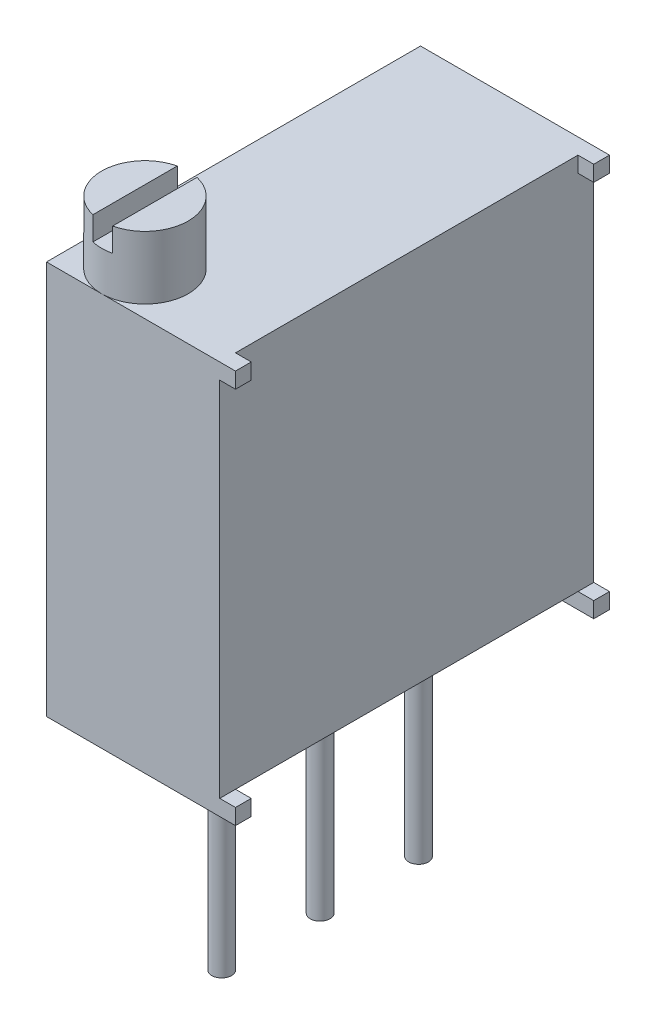
ISO-10303-21;
HEADER;
FILE_DESCRIPTION(('STEP AP214'),'2;1');
FILE_NAME('part.step','',(''),(''),'','','');
FILE_SCHEMA(('AUTOMOTIVE_DESIGN { 1 0 10303 214 1 1 1 1 }'));
ENDSEC;
DATA;
#1=APPLICATION_CONTEXT('core data for automotive mechanical design processes');
#2=APPLICATION_PROTOCOL_DEFINITION('international standard','automotive_design',2000,#1);
#3=PRODUCT_CONTEXT('',#1,'mechanical');
#4=PRODUCT('Part','Part','',(#3));
#5=PRODUCT_RELATED_PRODUCT_CATEGORY('part','',(#4));
#6=PRODUCT_DEFINITION_FORMATION('','',#4);
#7=PRODUCT_DEFINITION_CONTEXT('part definition',#1,'design');
#8=PRODUCT_DEFINITION('design','',#6,#7);
#9=PRODUCT_DEFINITION_SHAPE('','',#8);
#10=(LENGTH_UNIT() NAMED_UNIT(*) SI_UNIT(.MILLI.,.METRE.));
#11=(NAMED_UNIT(*) PLANE_ANGLE_UNIT() SI_UNIT($,.RADIAN.));
#12=(NAMED_UNIT(*) SI_UNIT($,.STERADIAN.) SOLID_ANGLE_UNIT());
#13=UNCERTAINTY_MEASURE_WITH_UNIT(LENGTH_MEASURE(1.E-05),#10,'distance_accuracy_value','');
#14=(GEOMETRIC_REPRESENTATION_CONTEXT(3) GLOBAL_UNCERTAINTY_ASSIGNED_CONTEXT((#13)) GLOBAL_UNIT_ASSIGNED_CONTEXT((#10,
#11,#12)) REPRESENTATION_CONTEXT('',''));
#15=CARTESIAN_POINT('',(0.,0.,0.));
#16=DIRECTION('',(0.,0.,1.));
#17=DIRECTION('',(1.,0.,0.));
#18=AXIS2_PLACEMENT_3D('',#15,#16,#17);
#19=CARTESIAN_POINT('',(1.4,6.4,3.65));
#20=DIRECTION('',(0.,-1.,0.));
#21=DIRECTION('',(0.,0.,-1.));
#22=AXIS2_PLACEMENT_3D('',#19,#20,#21);
#23=CYLINDRICAL_SURFACE('',#22,1.1);
#24=CARTESIAN_POINT('',(1.4,4.8,3.65));
#25=DIRECTION('',(0.,1.,0.));
#26=DIRECTION('',(0.,0.,1.));
#27=AXIS2_PLACEMENT_3D('',#24,#25,#26);
#28=CIRCLE('',#27,1.1);
#29=CARTESIAN_POINT('',(1.4,4.8,4.75));
#30=VERTEX_POINT('',#29);
#31=EDGE_CURVE('E203',#30,#30,#28,.T.);
#32=ORIENTED_EDGE('',*,*,#31,.T.);
#33=EDGE_LOOP('',(#32));
#34=FACE_BOUND('',#33,.T.);
#35=DIRECTION('',(0.,-1.,0.));
#36=VECTOR('',#35,1.);
#37=CARTESIAN_POINT('',(1.65,6.4,2.57878573571857));
#38=LINE('',#37,#36);
#39=CARTESIAN_POINT('',(1.65,6.4,2.57878573571857));
#40=VERTEX_POINT('',#39);
#41=CARTESIAN_POINT('',(1.65,5.8,2.57878573571857));
#42=VERTEX_POINT('',#41);
#43=EDGE_CURVE('E208',#40,#42,#38,.T.);
#44=ORIENTED_EDGE('',*,*,#43,.F.);
#45=CARTESIAN_POINT('',(1.4,6.4,3.65));
#46=DIRECTION('',(0.,1.,0.));
#47=DIRECTION('',(0.,0.,1.));
#48=AXIS2_PLACEMENT_3D('',#45,#46,#47);
#49=CIRCLE('',#48,1.1);
#50=CARTESIAN_POINT('',(1.65,6.4,4.72121426428143));
#51=VERTEX_POINT('',#50);
#52=EDGE_CURVE('E202',#51,#40,#49,.T.);
#53=ORIENTED_EDGE('',*,*,#52,.F.);
#54=DIRECTION('',(0.,-1.,0.));
#55=VECTOR('',#54,1.);
#56=CARTESIAN_POINT('',(1.65,6.4,4.72121426428143));
#57=LINE('',#56,#55);
#58=CARTESIAN_POINT('',(1.65,5.8,4.72121426428143));
#59=VERTEX_POINT('',#58);
#60=EDGE_CURVE('E610',#59,#51,#57,.F.);
#61=ORIENTED_EDGE('',*,*,#60,.F.);
#62=CARTESIAN_POINT('',(1.4,5.8,3.65));
#63=DIRECTION('',(0.,1.,0.));
#64=DIRECTION('',(0.,0.,1.));
#65=AXIS2_PLACEMENT_3D('',#62,#63,#64);
#66=CIRCLE('',#65,1.1);
#67=CARTESIAN_POINT('',(1.15,5.8,4.72121426428143));
#68=VERTEX_POINT('',#67);
#69=EDGE_CURVE('E198',#68,#59,#66,.T.);
#70=ORIENTED_EDGE('',*,*,#69,.F.);
#71=DIRECTION('',(0.,-1.,0.));
#72=VECTOR('',#71,1.);
#73=CARTESIAN_POINT('',(1.15,6.4,4.72121426428143));
#74=LINE('',#73,#72);
#75=CARTESIAN_POINT('',(1.15,6.4,4.72121426428143));
#76=VERTEX_POINT('',#75);
#77=EDGE_CURVE('E185',#68,#76,#74,.F.);
#78=ORIENTED_EDGE('',*,*,#77,.T.);
#79=CARTESIAN_POINT('',(1.15,6.4,2.57878573571857));
#80=VERTEX_POINT('',#79);
#81=EDGE_CURVE('E196',#80,#76,#49,.T.);
#82=ORIENTED_EDGE('',*,*,#81,.F.);
#83=DIRECTION('',(0.,-1.,0.));
#84=VECTOR('',#83,1.);
#85=CARTESIAN_POINT('',(1.15,6.4,2.57878573571857));
#86=LINE('',#85,#84);
#87=CARTESIAN_POINT('',(1.15,5.8,2.57878573571857));
#88=VERTEX_POINT('',#87);
#89=EDGE_CURVE('E52',#80,#88,#86,.T.);
#90=ORIENTED_EDGE('',*,*,#89,.T.);
#91=EDGE_CURVE('E347',#42,#88,#66,.T.);
#92=ORIENTED_EDGE('',*,*,#91,.F.);
#93=EDGE_LOOP('',(#44,#53,#61,#70,#78,#82,#90,#92));
#94=FACE_BOUND('',#93,.T.);
#95=ADVANCED_FACE('F37',(#34,#94),#23,.T.);
#96=CARTESIAN_POINT('',(1.4,6.4,3.65));
#97=DIRECTION('',(0.,1.,0.));
#98=DIRECTION('',(0.,0.,1.));
#99=AXIS2_PLACEMENT_3D('',#96,#97,#98);
#100=PLANE('',#99);
#101=ORIENTED_EDGE('',*,*,#52,.T.);
#102=DIRECTION('',(0.,0.,1.));
#103=VECTOR('',#102,1.);
#104=CARTESIAN_POINT('',(1.65,6.4,3.65));
#105=LINE('',#104,#103);
#106=EDGE_CURVE('E190',#40,#51,#105,.T.);
#107=ORIENTED_EDGE('',*,*,#106,.T.);
#108=EDGE_LOOP('',(#101,#107));
#109=FACE_BOUND('',#108,.T.);
#110=ADVANCED_FACE('F358',(#109),#100,.T.);
#111=CARTESIAN_POINT('',(4.4,-4.8,0.));
#112=DIRECTION('',(0.,1.,0.));
#113=DIRECTION('',(0.,0.,1.));
#114=AXIS2_PLACEMENT_3D('',#111,#112,#113);
#115=PLANE('',#114);
#116=CARTESIAN_POINT('',(2.2,-4.8,-2.5));
#117=DIRECTION('',(0.,1.,0.));
#118=DIRECTION('',(0.,0.,1.));
#119=AXIS2_PLACEMENT_3D('',#116,#117,#118);
#120=CIRCLE('',#119,0.25);
#121=CARTESIAN_POINT('',(2.2,-4.8,-2.25));
#122=VERTEX_POINT('',#121);
#123=EDGE_CURVE('E11',#122,#122,#120,.F.);
#124=ORIENTED_EDGE('',*,*,#123,.F.);
#125=EDGE_LOOP('',(#124));
#126=FACE_BOUND('',#125,.T.);
#127=CARTESIAN_POINT('',(2.2,-4.8,2.5));
#128=DIRECTION('',(0.,1.,0.));
#129=DIRECTION('',(0.,0.,1.));
#130=AXIS2_PLACEMENT_3D('',#127,#128,#129);
#131=CIRCLE('',#130,0.25);
#132=CARTESIAN_POINT('',(2.2,-4.8,2.75));
#133=VERTEX_POINT('',#132);
#134=EDGE_CURVE('E45',#133,#133,#131,.F.);
#135=ORIENTED_EDGE('',*,*,#134,.F.);
#136=EDGE_LOOP('',(#135));
#137=FACE_BOUND('',#136,.T.);
#138=CARTESIAN_POINT('',(2.2,-4.8,0.));
#139=DIRECTION('',(0.,1.,0.));
#140=DIRECTION('',(0.,0.,1.));
#141=AXIS2_PLACEMENT_3D('',#138,#139,#140);
#142=CIRCLE('',#141,0.25);
#143=CARTESIAN_POINT('',(2.2,-4.8,0.25));
#144=VERTEX_POINT('',#143);
#145=EDGE_CURVE('E348',#144,#144,#142,.F.);
#146=ORIENTED_EDGE('',*,*,#145,.F.);
#147=EDGE_LOOP('',(#146));
#148=FACE_BOUND('',#147,.T.);
#149=DIRECTION('',(0.,0.,-1.));
#150=VECTOR('',#149,1.);
#151=CARTESIAN_POINT('',(4.4,-4.8,0.));
#152=LINE('',#151,#150);
#153=CARTESIAN_POINT('',(4.4,-4.8,4.35));
#154=VERTEX_POINT('',#153);
#155=CARTESIAN_POINT('',(4.4,-4.8,-4.35));
#156=VERTEX_POINT('',#155);
#157=EDGE_CURVE('E60',#154,#156,#152,.T.);
#158=ORIENTED_EDGE('',*,*,#157,.F.);
#159=DIRECTION('',(-1.,0.,0.));
#160=VECTOR('',#159,1.);
#161=CARTESIAN_POINT('',(4.8,-4.8,4.35));
#162=LINE('',#161,#160);
#163=CARTESIAN_POINT('',(0.,-4.8,4.35));
#164=VERTEX_POINT('',#163);
#165=EDGE_CURVE('E217',#154,#164,#162,.T.);
#166=ORIENTED_EDGE('',*,*,#165,.T.);
#167=DIRECTION('',(0.,0.,-1.));
#168=VECTOR('',#167,1.);
#169=CARTESIAN_POINT('',(0.,-4.8,0.));
#170=LINE('',#169,#168);
#171=CARTESIAN_POINT('',(0.,-4.8,-4.35));
#172=VERTEX_POINT('',#171);
#173=EDGE_CURVE('E340',#164,#172,#170,.T.);
#174=ORIENTED_EDGE('',*,*,#173,.T.);
#175=DIRECTION('',(-1.,0.,0.));
#176=VECTOR('',#175,1.);
#177=CARTESIAN_POINT('',(4.8,-4.8,-4.35));
#178=LINE('',#177,#176);
#179=EDGE_CURVE('E191',#156,#172,#178,.T.);
#180=ORIENTED_EDGE('',*,*,#179,.F.);
#181=EDGE_LOOP('',(#158,#166,#174,#180));
#182=FACE_BOUND('',#181,.T.);
#183=ADVANCED_FACE('F355',(#126,#137,#148,#182),#115,.F.);
#184=CARTESIAN_POINT('',(4.4,4.8,0.));
#185=DIRECTION('',(0.,1.,0.));
#186=DIRECTION('',(0.,0.,1.));
#187=AXIS2_PLACEMENT_3D('',#184,#185,#186);
#188=PLANE('',#187);
#189=DIRECTION('',(-1.,0.,0.));
#190=VECTOR('',#189,1.);
#191=CARTESIAN_POINT('',(4.8,4.8,4.75));
#192=LINE('',#191,#190);
#193=CARTESIAN_POINT('',(0.,4.8,4.75));
#194=VERTEX_POINT('',#193);
#195=EDGE_CURVE('E250',#30,#194,#192,.T.);
#196=ORIENTED_EDGE('',*,*,#195,.F.);
#197=ORIENTED_EDGE('',*,*,#31,.F.);
#198=CARTESIAN_POINT('',(4.8,4.8,4.75));
#199=VERTEX_POINT('',#198);
#200=EDGE_CURVE('E251',#199,#30,#192,.T.);
#201=ORIENTED_EDGE('',*,*,#200,.F.);
#202=DIRECTION('',(0.,0.,-1.));
#203=VECTOR('',#202,1.);
#204=CARTESIAN_POINT('',(4.8,4.8,4.75));
#205=LINE('',#204,#203);
#206=CARTESIAN_POINT('',(4.8,4.8,4.35));
#207=VERTEX_POINT('',#206);
#208=EDGE_CURVE('E253',#199,#207,#205,.T.);
#209=ORIENTED_EDGE('',*,*,#208,.T.);
#210=DIRECTION('',(-1.,0.,0.));
#211=VECTOR('',#210,1.);
#212=CARTESIAN_POINT('',(4.8,4.8,4.35));
#213=LINE('',#212,#211);
#214=CARTESIAN_POINT('',(4.4,4.8,4.35));
#215=VERTEX_POINT('',#214);
#216=EDGE_CURVE('E247',#207,#215,#213,.T.);
#217=ORIENTED_EDGE('',*,*,#216,.T.);
#218=DIRECTION('',(0.,0.,-1.));
#219=VECTOR('',#218,1.);
#220=CARTESIAN_POINT('',(4.4,4.8,0.));
#221=LINE('',#220,#219);
#222=CARTESIAN_POINT('',(4.4,4.8,-4.35));
#223=VERTEX_POINT('',#222);
#224=EDGE_CURVE('E315',#215,#223,#221,.T.);
#225=ORIENTED_EDGE('',*,*,#224,.T.);
#226=DIRECTION('',(-1.,0.,0.));
#227=VECTOR('',#226,1.);
#228=CARTESIAN_POINT('',(4.8,4.8,-4.35));
#229=LINE('',#228,#227);
#230=CARTESIAN_POINT('',(4.8,4.8,-4.35));
#231=VERTEX_POINT('',#230);
#232=EDGE_CURVE('E311',#231,#223,#229,.T.);
#233=ORIENTED_EDGE('',*,*,#232,.F.);
#234=DIRECTION('',(0.,0.,-1.));
#235=VECTOR('',#234,1.);
#236=CARTESIAN_POINT('',(4.8,4.8,0.));
#237=LINE('',#236,#235);
#238=CARTESIAN_POINT('',(4.8,4.8,-4.75));
#239=VERTEX_POINT('',#238);
#240=EDGE_CURVE('E283',#231,#239,#237,.T.);
#241=ORIENTED_EDGE('',*,*,#240,.T.);
#242=DIRECTION('',(-1.,0.,0.));
#243=VECTOR('',#242,1.);
#244=CARTESIAN_POINT('',(4.8,4.8,-4.75));
#245=LINE('',#244,#243);
#246=CARTESIAN_POINT('',(0.,4.8,-4.75));
#247=VERTEX_POINT('',#246);
#248=EDGE_CURVE('E302',#239,#247,#245,.T.);
#249=ORIENTED_EDGE('',*,*,#248,.T.);
#250=DIRECTION('',(0.,0.,-1.));
#251=VECTOR('',#250,1.);
#252=CARTESIAN_POINT('',(0.,4.8,0.));
#253=LINE('',#252,#251);
#254=EDGE_CURVE('E314',#194,#247,#253,.T.);
#255=ORIENTED_EDGE('',*,*,#254,.F.);
#256=EDGE_LOOP('',(#196,#197,#201,#209,#217,#225,#233,#241,#249,#255));
#257=FACE_BOUND('',#256,.T.);
#258=ADVANCED_FACE('F39',(#257),#188,.T.);
#259=CARTESIAN_POINT('',(4.4,0.,4.75));
#260=DIRECTION('',(0.,0.,1.));
#261=DIRECTION('',(1.,0.,0.));
#262=AXIS2_PLACEMENT_3D('',#259,#260,#261);
#263=PLANE('',#262);
#264=DIRECTION('',(0.,1.,0.));
#265=VECTOR('',#264,1.);
#266=CARTESIAN_POINT('',(0.,0.,4.75));
#267=LINE('',#266,#265);
#268=CARTESIAN_POINT('',(0.,-5.2,4.75));
#269=VERTEX_POINT('',#268);
#270=EDGE_CURVE('E337',#269,#194,#267,.T.);
#271=ORIENTED_EDGE('',*,*,#270,.F.);
#272=DIRECTION('',(-1.,0.,0.));
#273=VECTOR('',#272,1.);
#274=CARTESIAN_POINT('',(4.8,-5.2,4.75));
#275=LINE('',#274,#273);
#276=CARTESIAN_POINT('',(4.8,-5.2,4.75));
#277=VERTEX_POINT('',#276);
#278=EDGE_CURVE('E206',#277,#269,#275,.T.);
#279=ORIENTED_EDGE('',*,*,#278,.F.);
#280=DIRECTION('',(0.,-1.,0.));
#281=VECTOR('',#280,1.);
#282=CARTESIAN_POINT('',(4.8,-4.8,4.75));
#283=LINE('',#282,#281);
#284=CARTESIAN_POINT('',(4.8,-4.8,4.75));
#285=VERTEX_POINT('',#284);
#286=EDGE_CURVE('E229',#285,#277,#283,.T.);
#287=ORIENTED_EDGE('',*,*,#286,.F.);
#288=DIRECTION('',(-1.,0.,0.));
#289=VECTOR('',#288,1.);
#290=CARTESIAN_POINT('',(4.8,-4.8,4.75));
#291=LINE('',#290,#289);
#292=CARTESIAN_POINT('',(4.4,-4.8,4.75));
#293=VERTEX_POINT('',#292);
#294=EDGE_CURVE('E221',#285,#293,#291,.T.);
#295=ORIENTED_EDGE('',*,*,#294,.T.);
#296=DIRECTION('',(0.,1.,0.));
#297=VECTOR('',#296,1.);
#298=CARTESIAN_POINT('',(4.4,0.,4.75));
#299=LINE('',#298,#297);
#300=CARTESIAN_POINT('',(4.4,4.4,4.75));
#301=VERTEX_POINT('',#300);
#302=EDGE_CURVE('E323',#293,#301,#299,.T.);
#303=ORIENTED_EDGE('',*,*,#302,.T.);
#304=DIRECTION('',(-1.,0.,0.));
#305=VECTOR('',#304,1.);
#306=CARTESIAN_POINT('',(4.8,4.4,4.75));
#307=LINE('',#306,#305);
#308=CARTESIAN_POINT('',(4.8,4.4,4.75));
#309=VERTEX_POINT('',#308);
#310=EDGE_CURVE('E232',#309,#301,#307,.T.);
#311=ORIENTED_EDGE('',*,*,#310,.F.);
#312=DIRECTION('',(0.,-1.,0.));
#313=VECTOR('',#312,1.);
#314=CARTESIAN_POINT('',(4.8,4.8,4.75));
#315=LINE('',#314,#313);
#316=EDGE_CURVE('E261',#199,#309,#315,.T.);
#317=ORIENTED_EDGE('',*,*,#316,.F.);
#318=ORIENTED_EDGE('',*,*,#200,.T.);
#319=ORIENTED_EDGE('',*,*,#195,.T.);
#320=EDGE_LOOP('',(#271,#279,#287,#295,#303,#311,#317,#318,#319));
#321=FACE_BOUND('',#320,.T.);
#322=ADVANCED_FACE('F453',(#321),#263,.T.);
#323=CARTESIAN_POINT('',(4.4,0.,-4.75));
#324=DIRECTION('',(0.,0.,1.));
#325=DIRECTION('',(1.,0.,0.));
#326=AXIS2_PLACEMENT_3D('',#323,#324,#325);
#327=PLANE('',#326);
#328=DIRECTION('',(0.,1.,0.));
#329=VECTOR('',#328,1.);
#330=CARTESIAN_POINT('',(0.,0.,-4.75));
#331=LINE('',#330,#329);
#332=CARTESIAN_POINT('',(0.,-5.2,-4.75));
#333=VERTEX_POINT('',#332);
#334=EDGE_CURVE('E318',#333,#247,#331,.T.);
#335=ORIENTED_EDGE('',*,*,#334,.T.);
#336=ORIENTED_EDGE('',*,*,#248,.F.);
#337=DIRECTION('',(0.,1.,0.));
#338=VECTOR('',#337,1.);
#339=CARTESIAN_POINT('',(4.8,0.,-4.75));
#340=LINE('',#339,#338);
#341=CARTESIAN_POINT('',(4.8,4.4,-4.75));
#342=VERTEX_POINT('',#341);
#343=EDGE_CURVE('E300',#342,#239,#340,.T.);
#344=ORIENTED_EDGE('',*,*,#343,.F.);
#345=DIRECTION('',(-1.,0.,0.));
#346=VECTOR('',#345,1.);
#347=CARTESIAN_POINT('',(4.8,4.4,-4.75));
#348=LINE('',#347,#346);
#349=CARTESIAN_POINT('',(4.4,4.4,-4.75));
#350=VERTEX_POINT('',#349);
#351=EDGE_CURVE('E305',#342,#350,#348,.T.);
#352=ORIENTED_EDGE('',*,*,#351,.T.);
#353=DIRECTION('',(0.,1.,0.));
#354=VECTOR('',#353,1.);
#355=CARTESIAN_POINT('',(4.4,0.,-4.75));
#356=LINE('',#355,#354);
#357=CARTESIAN_POINT('',(4.4,-4.8,-4.75));
#358=VERTEX_POINT('',#357);
#359=EDGE_CURVE('E329',#358,#350,#356,.T.);
#360=ORIENTED_EDGE('',*,*,#359,.F.);
#361=DIRECTION('',(-1.,0.,0.));
#362=VECTOR('',#361,1.);
#363=CARTESIAN_POINT('',(4.8,-4.8,-4.75));
#364=LINE('',#363,#362);
#365=CARTESIAN_POINT('',(4.8,-4.8,-4.75));
#366=VERTEX_POINT('',#365);
#367=EDGE_CURVE('E272',#366,#358,#364,.T.);
#368=ORIENTED_EDGE('',*,*,#367,.F.);
#369=DIRECTION('',(0.,-1.,0.));
#370=VECTOR('',#369,1.);
#371=CARTESIAN_POINT('',(4.8,0.,-4.74999999999999));
#372=LINE('',#371,#370);
#373=CARTESIAN_POINT('',(4.8,-5.2,-4.75));
#374=VERTEX_POINT('',#373);
#375=EDGE_CURVE('E275',#366,#374,#372,.T.);
#376=ORIENTED_EDGE('',*,*,#375,.T.);
#377=DIRECTION('',(-1.,0.,0.));
#378=VECTOR('',#377,1.);
#379=CARTESIAN_POINT('',(4.8,-5.2,-4.75));
#380=LINE('',#379,#378);
#381=EDGE_CURVE('E269',#374,#333,#380,.T.);
#382=ORIENTED_EDGE('',*,*,#381,.T.);
#383=EDGE_LOOP('',(#335,#336,#344,#352,#360,#368,#376,#382));
#384=FACE_BOUND('',#383,.T.);
#385=ADVANCED_FACE('F447',(#384),#327,.F.);
#386=CARTESIAN_POINT('',(4.4,0.,0.));
#387=DIRECTION('',(1.,0.,0.));
#388=DIRECTION('',(0.,0.,-1.));
#389=AXIS2_PLACEMENT_3D('',#386,#387,#388);
#390=PLANE('',#389);
#391=ORIENTED_EDGE('',*,*,#224,.F.);
#392=DIRECTION('',(0.,-1.,0.));
#393=VECTOR('',#392,1.);
#394=CARTESIAN_POINT('',(4.4,0.,4.35));
#395=LINE('',#394,#393);
#396=CARTESIAN_POINT('',(4.4,4.4,4.35));
#397=VERTEX_POINT('',#396);
#398=EDGE_CURVE('E317',#215,#397,#395,.T.);
#399=ORIENTED_EDGE('',*,*,#398,.T.);
#400=DIRECTION('',(0.,0.,-1.));
#401=VECTOR('',#400,1.);
#402=CARTESIAN_POINT('',(4.4,4.4,0.));
#403=LINE('',#402,#401);
#404=EDGE_CURVE('E320',#301,#397,#403,.T.);
#405=ORIENTED_EDGE('',*,*,#404,.F.);
#406=ORIENTED_EDGE('',*,*,#302,.F.);
#407=EDGE_CURVE('E327',#293,#154,#152,.T.);
#408=ORIENTED_EDGE('',*,*,#407,.T.);
#409=ORIENTED_EDGE('',*,*,#157,.T.);
#410=EDGE_CURVE('E326',#156,#358,#152,.T.);
#411=ORIENTED_EDGE('',*,*,#410,.T.);
#412=ORIENTED_EDGE('',*,*,#359,.T.);
#413=DIRECTION('',(0.,0.,1.));
#414=VECTOR('',#413,1.);
#415=CARTESIAN_POINT('',(4.4,4.4,0.));
#416=LINE('',#415,#414);
#417=CARTESIAN_POINT('',(4.4,4.4,-4.35));
#418=VERTEX_POINT('',#417);
#419=EDGE_CURVE('E331',#350,#418,#416,.T.);
#420=ORIENTED_EDGE('',*,*,#419,.T.);
#421=DIRECTION('',(0.,-1.,0.));
#422=VECTOR('',#421,1.);
#423=CARTESIAN_POINT('',(4.4,0.,-4.35000000000002));
#424=LINE('',#423,#422);
#425=EDGE_CURVE('E333',#223,#418,#424,.T.);
#426=ORIENTED_EDGE('',*,*,#425,.F.);
#427=EDGE_LOOP('',(#391,#399,#405,#406,#408,#409,#411,#412,#420,#426));
#428=FACE_BOUND('',#427,.T.);
#429=ADVANCED_FACE('F444',(#428),#390,.T.);
#430=CARTESIAN_POINT('',(0.,0.,0.));
#431=DIRECTION('',(1.,0.,0.));
#432=DIRECTION('',(0.,0.,-1.));
#433=AXIS2_PLACEMENT_3D('',#430,#431,#432);
#434=PLANE('',#433);
#435=ORIENTED_EDGE('',*,*,#254,.T.);
#436=ORIENTED_EDGE('',*,*,#334,.F.);
#437=DIRECTION('',(0.,0.,1.));
#438=VECTOR('',#437,1.);
#439=CARTESIAN_POINT('',(0.,-5.2,0.));
#440=LINE('',#439,#438);
#441=CARTESIAN_POINT('',(0.,-5.2,-4.35));
#442=VERTEX_POINT('',#441);
#443=EDGE_CURVE('E276',#333,#442,#440,.T.);
#444=ORIENTED_EDGE('',*,*,#443,.T.);
#445=DIRECTION('',(0.,-1.,0.));
#446=VECTOR('',#445,1.);
#447=CARTESIAN_POINT('',(0.,0.,-4.34999999999999));
#448=LINE('',#447,#446);
#449=EDGE_CURVE('E279',#172,#442,#448,.T.);
#450=ORIENTED_EDGE('',*,*,#449,.F.);
#451=ORIENTED_EDGE('',*,*,#173,.F.);
#452=DIRECTION('',(0.,-1.,0.));
#453=VECTOR('',#452,1.);
#454=CARTESIAN_POINT('',(0.,-4.8,4.35));
#455=LINE('',#454,#453);
#456=CARTESIAN_POINT('',(0.,-5.2,4.35));
#457=VERTEX_POINT('',#456);
#458=EDGE_CURVE('E225',#164,#457,#455,.T.);
#459=ORIENTED_EDGE('',*,*,#458,.T.);
#460=DIRECTION('',(0.,0.,-1.));
#461=VECTOR('',#460,1.);
#462=CARTESIAN_POINT('',(0.,-5.2,4.75));
#463=LINE('',#462,#461);
#464=EDGE_CURVE('E228',#269,#457,#463,.T.);
#465=ORIENTED_EDGE('',*,*,#464,.F.);
#466=ORIENTED_EDGE('',*,*,#270,.T.);
#467=EDGE_LOOP('',(#435,#436,#444,#450,#451,#459,#465,#466));
#468=FACE_BOUND('',#467,.T.);
#469=ADVANCED_FACE('F442',(#468),#434,.F.);
#470=CARTESIAN_POINT('',(4.8,0.,-4.35000000000002));
#471=DIRECTION('',(0.,0.,-1.));
#472=DIRECTION('',(0.,1.,0.));
#473=AXIS2_PLACEMENT_3D('',#470,#471,#472);
#474=PLANE('',#473);
#475=ORIENTED_EDGE('',*,*,#425,.T.);
#476=DIRECTION('',(-1.,0.,0.));
#477=VECTOR('',#476,1.);
#478=CARTESIAN_POINT('',(4.8,4.4,-4.35));
#479=LINE('',#478,#477);
#480=CARTESIAN_POINT('',(4.8,4.4,-4.35));
#481=VERTEX_POINT('',#480);
#482=EDGE_CURVE('E308',#481,#418,#479,.T.);
#483=ORIENTED_EDGE('',*,*,#482,.F.);
#484=DIRECTION('',(0.,-1.,0.));
#485=VECTOR('',#484,1.);
#486=CARTESIAN_POINT('',(4.8,0.,-4.35000000000002));
#487=LINE('',#486,#485);
#488=EDGE_CURVE('E295',#231,#481,#487,.T.);
#489=ORIENTED_EDGE('',*,*,#488,.F.);
#490=ORIENTED_EDGE('',*,*,#232,.T.);
#491=EDGE_LOOP('',(#475,#483,#489,#490));
#492=FACE_BOUND('',#491,.T.);
#493=ADVANCED_FACE('F438',(#492),#474,.F.);
#494=CARTESIAN_POINT('',(4.8,4.4,0.));
#495=DIRECTION('',(0.,-1.,0.));
#496=DIRECTION('',(0.,0.,-1.));
#497=AXIS2_PLACEMENT_3D('',#494,#495,#496);
#498=PLANE('',#497);
#499=ORIENTED_EDGE('',*,*,#482,.T.);
#500=ORIENTED_EDGE('',*,*,#419,.F.);
#501=ORIENTED_EDGE('',*,*,#351,.F.);
#502=DIRECTION('',(0.,0.,1.));
#503=VECTOR('',#502,1.);
#504=CARTESIAN_POINT('',(4.8,4.4,0.));
#505=LINE('',#504,#503);
#506=EDGE_CURVE('E297',#342,#481,#505,.T.);
#507=ORIENTED_EDGE('',*,*,#506,.T.);
#508=EDGE_LOOP('',(#499,#500,#501,#507));
#509=FACE_BOUND('',#508,.T.);
#510=ADVANCED_FACE('F434',(#509),#498,.T.);
#511=CARTESIAN_POINT('',(4.8,0.,0.));
#512=DIRECTION('',(1.,0.,0.));
#513=DIRECTION('',(0.,0.,-1.));
#514=AXIS2_PLACEMENT_3D('',#511,#512,#513);
#515=PLANE('',#514);
#516=ORIENTED_EDGE('',*,*,#240,.F.);
#517=ORIENTED_EDGE('',*,*,#488,.T.);
#518=ORIENTED_EDGE('',*,*,#506,.F.);
#519=ORIENTED_EDGE('',*,*,#343,.T.);
#520=EDGE_LOOP('',(#516,#517,#518,#519));
#521=FACE_BOUND('',#520,.T.);
#522=ADVANCED_FACE('F420',(#521),#515,.T.);
#523=CARTESIAN_POINT('',(4.8,-4.8,0.));
#524=DIRECTION('',(0.,1.,0.));
#525=DIRECTION('',(0.,0.,1.));
#526=AXIS2_PLACEMENT_3D('',#523,#524,#525);
#527=PLANE('',#526);
#528=ORIENTED_EDGE('',*,*,#410,.F.);
#529=CARTESIAN_POINT('',(4.8,-4.8,-4.35));
#530=VERTEX_POINT('',#529);
#531=EDGE_CURVE('E264',#530,#156,#178,.T.);
#532=ORIENTED_EDGE('',*,*,#531,.F.);
#533=DIRECTION('',(0.,0.,-1.));
#534=VECTOR('',#533,1.);
#535=CARTESIAN_POINT('',(4.8,-4.8,0.));
#536=LINE('',#535,#534);
#537=EDGE_CURVE('E280',#530,#366,#536,.T.);
#538=ORIENTED_EDGE('',*,*,#537,.T.);
#539=ORIENTED_EDGE('',*,*,#367,.T.);
#540=EDGE_LOOP('',(#528,#532,#538,#539));
#541=FACE_BOUND('',#540,.T.);
#542=ADVANCED_FACE('F416',(#541),#527,.T.);
#543=CARTESIAN_POINT('',(4.8,0.,-4.34999999999999));
#544=DIRECTION('',(0.,0.,-1.));
#545=DIRECTION('',(0.,1.,0.));
#546=AXIS2_PLACEMENT_3D('',#543,#544,#545);
#547=PLANE('',#546);
#548=ORIENTED_EDGE('',*,*,#449,.T.);
#549=DIRECTION('',(-1.,0.,0.));
#550=VECTOR('',#549,1.);
#551=CARTESIAN_POINT('',(4.8,-5.2,-4.35));
#552=LINE('',#551,#550);
#553=CARTESIAN_POINT('',(4.8,-5.2,-4.35));
#554=VERTEX_POINT('',#553);
#555=EDGE_CURVE('E267',#554,#442,#552,.T.);
#556=ORIENTED_EDGE('',*,*,#555,.F.);
#557=DIRECTION('',(0.,-1.,0.));
#558=VECTOR('',#557,1.);
#559=CARTESIAN_POINT('',(4.8,0.,-4.34999999999999));
#560=LINE('',#559,#558);
#561=EDGE_CURVE('E289',#530,#554,#560,.T.);
#562=ORIENTED_EDGE('',*,*,#561,.F.);
#563=ORIENTED_EDGE('',*,*,#531,.T.);
#564=ORIENTED_EDGE('',*,*,#179,.T.);
#565=EDGE_LOOP('',(#548,#556,#562,#563,#564));
#566=FACE_BOUND('',#565,.T.);
#567=ADVANCED_FACE('F419',(#566),#547,.F.);
#568=CARTESIAN_POINT('',(4.8,-5.2,0.));
#569=DIRECTION('',(0.,-1.,0.));
#570=DIRECTION('',(0.,0.,-1.));
#571=AXIS2_PLACEMENT_3D('',#568,#569,#570);
#572=PLANE('',#571);
#573=ORIENTED_EDGE('',*,*,#443,.F.);
#574=ORIENTED_EDGE('',*,*,#381,.F.);
#575=DIRECTION('',(0.,0.,1.));
#576=VECTOR('',#575,1.);
#577=CARTESIAN_POINT('',(4.8,-5.2,0.));
#578=LINE('',#577,#576);
#579=EDGE_CURVE('E286',#374,#554,#578,.T.);
#580=ORIENTED_EDGE('',*,*,#579,.T.);
#581=ORIENTED_EDGE('',*,*,#555,.T.);
#582=EDGE_LOOP('',(#573,#574,#580,#581));
#583=FACE_BOUND('',#582,.T.);
#584=ADVANCED_FACE('F424',(#583),#572,.T.);
#585=CARTESIAN_POINT('',(4.8,0.,0.));
#586=DIRECTION('',(1.,0.,0.));
#587=DIRECTION('',(0.,0.,-1.));
#588=AXIS2_PLACEMENT_3D('',#585,#586,#587);
#589=PLANE('',#588);
#590=ORIENTED_EDGE('',*,*,#537,.F.);
#591=ORIENTED_EDGE('',*,*,#561,.T.);
#592=ORIENTED_EDGE('',*,*,#579,.F.);
#593=ORIENTED_EDGE('',*,*,#375,.F.);
#594=EDGE_LOOP('',(#590,#591,#592,#593));
#595=FACE_BOUND('',#594,.T.);
#596=ADVANCED_FACE('F408',(#595),#589,.T.);
#597=CARTESIAN_POINT('',(4.8,4.4,4.75));
#598=DIRECTION('',(0.,1.,0.));
#599=DIRECTION('',(0.,0.,1.));
#600=AXIS2_PLACEMENT_3D('',#597,#598,#599);
#601=PLANE('',#600);
#602=ORIENTED_EDGE('',*,*,#404,.T.);
#603=DIRECTION('',(-1.,0.,0.));
#604=VECTOR('',#603,1.);
#605=CARTESIAN_POINT('',(4.8,4.4,4.35));
#606=LINE('',#605,#604);
#607=CARTESIAN_POINT('',(4.8,4.4,4.35));
#608=VERTEX_POINT('',#607);
#609=EDGE_CURVE('E244',#608,#397,#606,.T.);
#610=ORIENTED_EDGE('',*,*,#609,.F.);
#611=DIRECTION('',(0.,0.,-1.));
#612=VECTOR('',#611,1.);
#613=CARTESIAN_POINT('',(4.8,4.4,4.75));
#614=LINE('',#613,#612);
#615=EDGE_CURVE('E259',#309,#608,#614,.T.);
#616=ORIENTED_EDGE('',*,*,#615,.F.);
#617=ORIENTED_EDGE('',*,*,#310,.T.);
#618=EDGE_LOOP('',(#602,#610,#616,#617));
#619=FACE_BOUND('',#618,.T.);
#620=ADVANCED_FACE('F404',(#619),#601,.F.);
#621=CARTESIAN_POINT('',(4.8,4.8,4.35));
#622=DIRECTION('',(0.,0.,-1.));
#623=DIRECTION('',(-1.,0.,0.));
#624=AXIS2_PLACEMENT_3D('',#621,#622,#623);
#625=PLANE('',#624);
#626=ORIENTED_EDGE('',*,*,#609,.T.);
#627=ORIENTED_EDGE('',*,*,#398,.F.);
#628=ORIENTED_EDGE('',*,*,#216,.F.);
#629=DIRECTION('',(0.,-1.,0.));
#630=VECTOR('',#629,1.);
#631=CARTESIAN_POINT('',(4.8,4.8,4.35));
#632=LINE('',#631,#630);
#633=EDGE_CURVE('E256',#207,#608,#632,.T.);
#634=ORIENTED_EDGE('',*,*,#633,.T.);
#635=EDGE_LOOP('',(#626,#627,#628,#634));
#636=FACE_BOUND('',#635,.T.);
#637=ADVANCED_FACE('F407',(#636),#625,.T.);
#638=CARTESIAN_POINT('',(4.8,0.,0.));
#639=DIRECTION('',(1.,0.,0.));
#640=DIRECTION('',(0.,0.,-1.));
#641=AXIS2_PLACEMENT_3D('',#638,#639,#640);
#642=PLANE('',#641);
#643=ORIENTED_EDGE('',*,*,#316,.T.);
#644=ORIENTED_EDGE('',*,*,#615,.T.);
#645=ORIENTED_EDGE('',*,*,#633,.F.);
#646=ORIENTED_EDGE('',*,*,#208,.F.);
#647=EDGE_LOOP('',(#643,#644,#645,#646));
#648=FACE_BOUND('',#647,.T.);
#649=ADVANCED_FACE('F391',(#648),#642,.T.);
#650=CARTESIAN_POINT('',(4.8,-5.2,4.75));
#651=DIRECTION('',(0.,1.,0.));
#652=DIRECTION('',(0.,0.,1.));
#653=AXIS2_PLACEMENT_3D('',#650,#651,#652);
#654=PLANE('',#653);
#655=ORIENTED_EDGE('',*,*,#464,.T.);
#656=DIRECTION('',(-1.,0.,0.));
#657=VECTOR('',#656,1.);
#658=CARTESIAN_POINT('',(4.8,-5.2,4.35));
#659=LINE('',#658,#657);
#660=CARTESIAN_POINT('',(4.8,-5.2,4.35));
#661=VERTEX_POINT('',#660);
#662=EDGE_CURVE('E215',#661,#457,#659,.T.);
#663=ORIENTED_EDGE('',*,*,#662,.F.);
#664=DIRECTION('',(0.,0.,-1.));
#665=VECTOR('',#664,1.);
#666=CARTESIAN_POINT('',(4.8,-5.2,4.75));
#667=LINE('',#666,#665);
#668=EDGE_CURVE('E238',#277,#661,#667,.T.);
#669=ORIENTED_EDGE('',*,*,#668,.F.);
#670=ORIENTED_EDGE('',*,*,#278,.T.);
#671=EDGE_LOOP('',(#655,#663,#669,#670));
#672=FACE_BOUND('',#671,.T.);
#673=ADVANCED_FACE('F387',(#672),#654,.F.);
#674=CARTESIAN_POINT('',(4.8,-4.8,4.35));
#675=DIRECTION('',(0.,0.,-1.));
#676=DIRECTION('',(0.,1.,0.));
#677=AXIS2_PLACEMENT_3D('',#674,#675,#676);
#678=PLANE('',#677);
#679=ORIENTED_EDGE('',*,*,#458,.F.);
#680=ORIENTED_EDGE('',*,*,#165,.F.);
#681=CARTESIAN_POINT('',(4.8,-4.8,4.35));
#682=VERTEX_POINT('',#681);
#683=EDGE_CURVE('E218',#682,#154,#162,.T.);
#684=ORIENTED_EDGE('',*,*,#683,.F.);
#685=DIRECTION('',(0.,-1.,0.));
#686=VECTOR('',#685,1.);
#687=CARTESIAN_POINT('',(4.8,-4.8,4.35));
#688=LINE('',#687,#686);
#689=EDGE_CURVE('E235',#682,#661,#688,.T.);
#690=ORIENTED_EDGE('',*,*,#689,.T.);
#691=ORIENTED_EDGE('',*,*,#662,.T.);
#692=EDGE_LOOP('',(#679,#680,#684,#690,#691));
#693=FACE_BOUND('',#692,.T.);
#694=ADVANCED_FACE('F390',(#693),#678,.T.);
#695=CARTESIAN_POINT('',(4.8,-4.8,4.75));
#696=DIRECTION('',(0.,1.,0.));
#697=DIRECTION('',(0.,0.,1.));
#698=AXIS2_PLACEMENT_3D('',#695,#696,#697);
#699=PLANE('',#698);
#700=ORIENTED_EDGE('',*,*,#683,.T.);
#701=ORIENTED_EDGE('',*,*,#407,.F.);
#702=ORIENTED_EDGE('',*,*,#294,.F.);
#703=DIRECTION('',(0.,0.,-1.));
#704=VECTOR('',#703,1.);
#705=CARTESIAN_POINT('',(4.8,-4.8,4.75));
#706=LINE('',#705,#704);
#707=EDGE_CURVE('E224',#285,#682,#706,.T.);
#708=ORIENTED_EDGE('',*,*,#707,.T.);
#709=EDGE_LOOP('',(#700,#701,#702,#708));
#710=FACE_BOUND('',#709,.T.);
#711=ADVANCED_FACE('F395',(#710),#699,.T.);
#712=CARTESIAN_POINT('',(4.8,0.,0.));
#713=DIRECTION('',(1.,0.,0.));
#714=DIRECTION('',(0.,0.,-1.));
#715=AXIS2_PLACEMENT_3D('',#712,#713,#714);
#716=PLANE('',#715);
#717=ORIENTED_EDGE('',*,*,#286,.T.);
#718=ORIENTED_EDGE('',*,*,#668,.T.);
#719=ORIENTED_EDGE('',*,*,#689,.F.);
#720=ORIENTED_EDGE('',*,*,#707,.F.);
#721=EDGE_LOOP('',(#717,#718,#719,#720));
#722=FACE_BOUND('',#721,.T.);
#723=ADVANCED_FACE('F399',(#722),#716,.T.);
#724=DIRECTION('',(0.,0.,1.));
#725=VECTOR('',#724,1.);
#726=CARTESIAN_POINT('',(1.15,6.4,3.65));
#727=LINE('',#726,#725);
#728=EDGE_CURVE('E182',#80,#76,#727,.T.);
#729=ORIENTED_EDGE('',*,*,#728,.F.);
#730=ORIENTED_EDGE('',*,*,#81,.T.);
#731=EDGE_LOOP('',(#729,#730));
#732=FACE_BOUND('',#731,.T.);
#733=ADVANCED_FACE('F201',(#732),#100,.T.);
#734=CARTESIAN_POINT('',(0.,5.8,0.));
#735=DIRECTION('',(0.,1.,0.));
#736=DIRECTION('',(0.,0.,1.));
#737=AXIS2_PLACEMENT_3D('',#734,#735,#736);
#738=PLANE('',#737);
#739=DIRECTION('',(0.,0.,1.));
#740=VECTOR('',#739,1.);
#741=CARTESIAN_POINT('',(1.65,5.8,3.65));
#742=LINE('',#741,#740);
#743=EDGE_CURVE('E199',#42,#59,#742,.T.);
#744=ORIENTED_EDGE('',*,*,#743,.F.);
#745=ORIENTED_EDGE('',*,*,#91,.T.);
#746=DIRECTION('',(0.,0.,1.));
#747=VECTOR('',#746,1.);
#748=CARTESIAN_POINT('',(1.15,5.8,3.65));
#749=LINE('',#748,#747);
#750=EDGE_CURVE('E606',#88,#68,#749,.T.);
#751=ORIENTED_EDGE('',*,*,#750,.T.);
#752=ORIENTED_EDGE('',*,*,#69,.T.);
#753=EDGE_LOOP('',(#744,#745,#751,#752));
#754=FACE_BOUND('',#753,.T.);
#755=ADVANCED_FACE('F520',(#754),#738,.T.);
#756=CARTESIAN_POINT('',(1.65,5.8,3.65));
#757=DIRECTION('',(-1.,0.,0.));
#758=DIRECTION('',(0.,0.,1.));
#759=AXIS2_PLACEMENT_3D('',#756,#757,#758);
#760=PLANE('',#759);
#761=ORIENTED_EDGE('',*,*,#43,.T.);
#762=ORIENTED_EDGE('',*,*,#743,.T.);
#763=ORIENTED_EDGE('',*,*,#60,.T.);
#764=ORIENTED_EDGE('',*,*,#106,.F.);
#765=EDGE_LOOP('',(#761,#762,#763,#764));
#766=FACE_BOUND('',#765,.T.);
#767=ADVANCED_FACE('F374',(#766),#760,.T.);
#768=CARTESIAN_POINT('',(1.15,5.8,3.65));
#769=DIRECTION('',(-1.,0.,0.));
#770=DIRECTION('',(0.,0.,1.));
#771=AXIS2_PLACEMENT_3D('',#768,#769,#770);
#772=PLANE('',#771);
#773=ORIENTED_EDGE('',*,*,#728,.T.);
#774=ORIENTED_EDGE('',*,*,#77,.F.);
#775=ORIENTED_EDGE('',*,*,#750,.F.);
#776=ORIENTED_EDGE('',*,*,#89,.F.);
#777=EDGE_LOOP('',(#773,#774,#775,#776));
#778=FACE_BOUND('',#777,.T.);
#779=ADVANCED_FACE('F184',(#778),#772,.F.);
#780=CARTESIAN_POINT('',(2.2,-10.8,0.));
#781=DIRECTION('',(0.,1.,0.));
#782=DIRECTION('',(0.,0.,1.));
#783=AXIS2_PLACEMENT_3D('',#780,#781,#782);
#784=CYLINDRICAL_SURFACE('',#783,0.25);
#785=CARTESIAN_POINT('',(2.2,-10.8,0.));
#786=DIRECTION('',(0.,-1.,0.));
#787=DIRECTION('',(0.,0.,-1.));
#788=AXIS2_PLACEMENT_3D('',#785,#786,#787);
#789=CIRCLE('',#788,0.25);
#790=CARTESIAN_POINT('',(2.2,-10.8,-0.25));
#791=VERTEX_POINT('',#790);
#792=EDGE_CURVE('E601',#791,#791,#789,.T.);
#793=ORIENTED_EDGE('',*,*,#792,.F.);
#794=EDGE_LOOP('',(#793));
#795=FACE_BOUND('',#794,.T.);
#796=ORIENTED_EDGE('',*,*,#145,.T.);
#797=EDGE_LOOP('',(#796));
#798=FACE_BOUND('',#797,.T.);
#799=ADVANCED_FACE('F363',(#795,#798),#784,.T.);
#800=CARTESIAN_POINT('',(2.2,-10.8,0.));
#801=DIRECTION('',(0.,-1.,0.));
#802=DIRECTION('',(0.,0.,-1.));
#803=AXIS2_PLACEMENT_3D('',#800,#801,#802);
#804=PLANE('',#803);
#805=ORIENTED_EDGE('',*,*,#792,.T.);
#806=EDGE_LOOP('',(#805));
#807=FACE_BOUND('',#806,.T.);
#808=ADVANCED_FACE('F365',(#807),#804,.T.);
#809=CARTESIAN_POINT('',(2.2,-10.8,2.5));
#810=DIRECTION('',(0.,1.,0.));
#811=DIRECTION('',(0.,0.,1.));
#812=AXIS2_PLACEMENT_3D('',#809,#810,#811);
#813=CYLINDRICAL_SURFACE('',#812,0.25);
#814=CARTESIAN_POINT('',(2.2,-10.8,2.5));
#815=DIRECTION('',(0.,-1.,0.));
#816=DIRECTION('',(0.,0.,-1.));
#817=AXIS2_PLACEMENT_3D('',#814,#815,#816);
#818=CIRCLE('',#817,0.25);
#819=CARTESIAN_POINT('',(2.2,-10.8,2.25));
#820=VERTEX_POINT('',#819);
#821=EDGE_CURVE('E598',#820,#820,#818,.T.);
#822=ORIENTED_EDGE('',*,*,#821,.F.);
#823=EDGE_LOOP('',(#822));
#824=FACE_BOUND('',#823,.T.);
#825=ORIENTED_EDGE('',*,*,#134,.T.);
#826=EDGE_LOOP('',(#825));
#827=FACE_BOUND('',#826,.T.);
#828=ADVANCED_FACE('F353',(#824,#827),#813,.T.);
#829=CARTESIAN_POINT('',(2.2,-10.8,2.5));
#830=DIRECTION('',(0.,-1.,0.));
#831=DIRECTION('',(0.,0.,-1.));
#832=AXIS2_PLACEMENT_3D('',#829,#830,#831);
#833=PLANE('',#832);
#834=ORIENTED_EDGE('',*,*,#821,.T.);
#835=EDGE_LOOP('',(#834));
#836=FACE_BOUND('',#835,.T.);
#837=ADVANCED_FACE('F561',(#836),#833,.T.);
#838=CARTESIAN_POINT('',(2.2,-10.8,-2.5));
#839=DIRECTION('',(0.,1.,0.));
#840=DIRECTION('',(0.,0.,1.));
#841=AXIS2_PLACEMENT_3D('',#838,#839,#840);
#842=CYLINDRICAL_SURFACE('',#841,0.25);
#843=CARTESIAN_POINT('',(2.2,-10.8,-2.5));
#844=DIRECTION('',(0.,-1.,0.));
#845=DIRECTION('',(0.,0.,-1.));
#846=AXIS2_PLACEMENT_3D('',#843,#844,#845);
#847=CIRCLE('',#846,0.25);
#848=CARTESIAN_POINT('',(2.2,-10.8,-2.75));
#849=VERTEX_POINT('',#848);
#850=EDGE_CURVE('E597',#849,#849,#847,.T.);
#851=ORIENTED_EDGE('',*,*,#850,.F.);
#852=EDGE_LOOP('',(#851));
#853=FACE_BOUND('',#852,.T.);
#854=ORIENTED_EDGE('',*,*,#123,.T.);
#855=EDGE_LOOP('',(#854));
#856=FACE_BOUND('',#855,.T.);
#857=ADVANCED_FACE('F570',(#853,#856),#842,.T.);
#858=CARTESIAN_POINT('',(2.2,-10.8,-2.5));
#859=DIRECTION('',(0.,-1.,0.));
#860=DIRECTION('',(0.,0.,-1.));
#861=AXIS2_PLACEMENT_3D('',#858,#859,#860);
#862=PLANE('',#861);
#863=ORIENTED_EDGE('',*,*,#850,.T.);
#864=EDGE_LOOP('',(#863));
#865=FACE_BOUND('',#864,.T.);
#866=ADVANCED_FACE('F579',(#865),#862,.T.);
#867=CLOSED_SHELL('',(#95,#110,#183,#258,#322,#385,#429,#469,#493,#510,#522,#542,#567,#584,#596,
#620,#637,#649,#673,#694,#711,#723,#733,#755,#767,#779,#799,#808,#828,#837,#857,#866));
#868=MANIFOLD_SOLID_BREP('B2',#867);
#869=ADVANCED_BREP_SHAPE_REPRESENTATION('',(#18,#868),#14);
#870=SHAPE_DEFINITION_REPRESENTATION(#9,#869);
ENDSEC;
END-ISO-10303-21;
